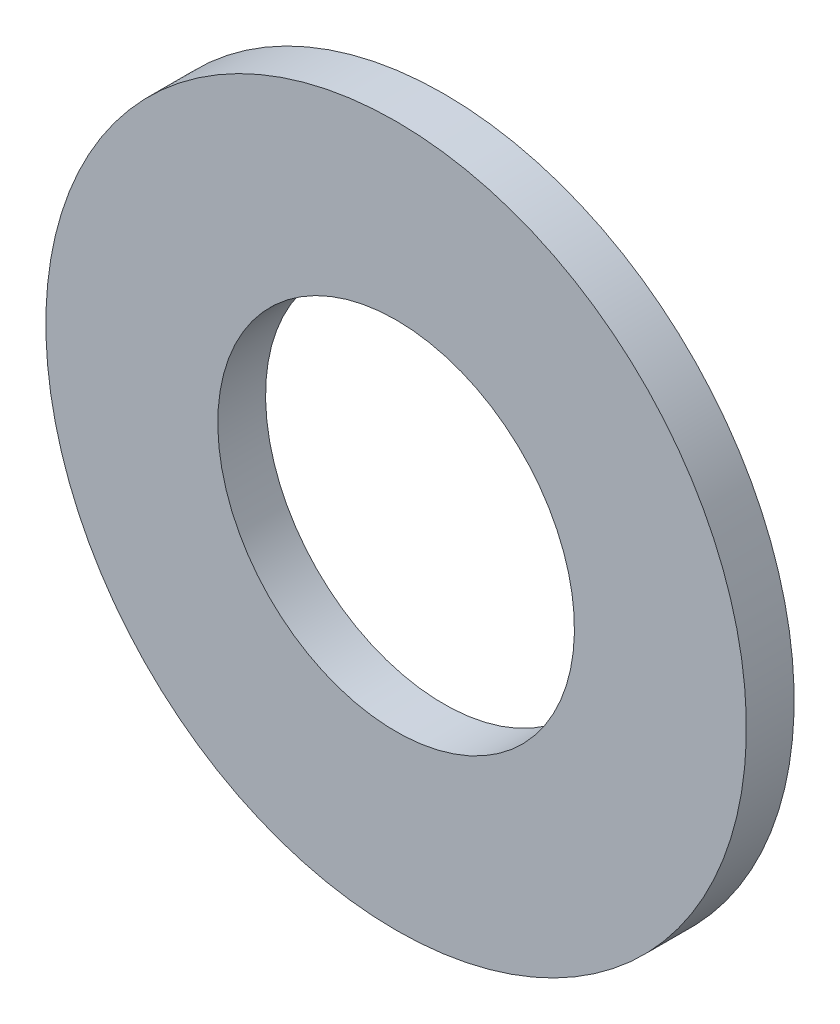
ISO-10303-21;
HEADER;
FILE_DESCRIPTION(('STEP AP214'),'2;1');
FILE_NAME('part.step','',(''),(''),'','','');
FILE_SCHEMA(('AUTOMOTIVE_DESIGN { 1 0 10303 214 1 1 1 1 }'));
ENDSEC;
DATA;
#1=APPLICATION_CONTEXT('core data for automotive mechanical design processes');
#2=APPLICATION_PROTOCOL_DEFINITION('international standard','automotive_design',2000,#1);
#3=PRODUCT_CONTEXT('',#1,'mechanical');
#4=PRODUCT('Part','Part','',(#3));
#5=PRODUCT_RELATED_PRODUCT_CATEGORY('part','',(#4));
#6=PRODUCT_DEFINITION_FORMATION('','',#4);
#7=PRODUCT_DEFINITION_CONTEXT('part definition',#1,'design');
#8=PRODUCT_DEFINITION('design','',#6,#7);
#9=PRODUCT_DEFINITION_SHAPE('','',#8);
#10=(LENGTH_UNIT() NAMED_UNIT(*) SI_UNIT(.MILLI.,.METRE.));
#11=(NAMED_UNIT(*) PLANE_ANGLE_UNIT() SI_UNIT($,.RADIAN.));
#12=(NAMED_UNIT(*) SI_UNIT($,.STERADIAN.) SOLID_ANGLE_UNIT());
#13=UNCERTAINTY_MEASURE_WITH_UNIT(LENGTH_MEASURE(1.E-05),#10,'distance_accuracy_value','');
#14=(GEOMETRIC_REPRESENTATION_CONTEXT(3) GLOBAL_UNCERTAINTY_ASSIGNED_CONTEXT((#13)) GLOBAL_UNIT_ASSIGNED_CONTEXT((#10,
#11,#12)) REPRESENTATION_CONTEXT('',''));
#15=CARTESIAN_POINT('',(0.,0.,0.));
#16=DIRECTION('',(0.,0.,1.));
#17=DIRECTION('',(1.,0.,0.));
#18=AXIS2_PLACEMENT_3D('',#15,#16,#17);
#19=CARTESIAN_POINT('',(0.,0.,0.));
#20=DIRECTION('',(0.,0.,-1.));
#21=DIRECTION('',(0.,1.,0.));
#22=AXIS2_PLACEMENT_3D('',#19,#20,#21);
#23=CYLINDRICAL_SURFACE('',#22,5.6);
#24=CARTESIAN_POINT('',(0.,0.,1.5));
#25=DIRECTION('',(0.,0.,-1.));
#26=DIRECTION('',(0.,1.,0.));
#27=AXIS2_PLACEMENT_3D('',#24,#25,#26);
#28=CIRCLE('',#27,5.6);
#29=CARTESIAN_POINT('',(0.,5.6,1.5));
#30=VERTEX_POINT('',#29);
#31=EDGE_CURVE('E10',#30,#30,#28,.T.);
#32=ORIENTED_EDGE('',*,*,#31,.F.);
#33=EDGE_LOOP('',(#32));
#34=FACE_BOUND('',#33,.T.);
#35=CARTESIAN_POINT('',(0.,0.,0.));
#36=DIRECTION('',(0.,0.,-1.));
#37=DIRECTION('',(0.,1.,0.));
#38=AXIS2_PLACEMENT_3D('',#35,#36,#37);
#39=CIRCLE('',#38,5.6);
#40=CARTESIAN_POINT('',(0.,5.6,0.));
#41=VERTEX_POINT('',#40);
#42=EDGE_CURVE('E29',#41,#41,#39,.T.);
#43=ORIENTED_EDGE('',*,*,#42,.T.);
#44=EDGE_LOOP('',(#43));
#45=FACE_BOUND('',#44,.T.);
#46=ADVANCED_FACE('F15',(#34,#45),#23,.F.);
#47=CARTESIAN_POINT('',(11.,0.,1.5));
#48=DIRECTION('',(0.,0.,1.));
#49=DIRECTION('',(0.,-1.,0.));
#50=AXIS2_PLACEMENT_3D('',#47,#48,#49);
#51=PLANE('',#50);
#52=ORIENTED_EDGE('',*,*,#31,.T.);
#53=EDGE_LOOP('',(#52));
#54=FACE_BOUND('',#53,.T.);
#55=CARTESIAN_POINT('',(0.,0.,1.5));
#56=DIRECTION('',(0.,0.,-1.));
#57=DIRECTION('',(0.,1.,0.));
#58=AXIS2_PLACEMENT_3D('',#55,#56,#57);
#59=CIRCLE('',#58,11.);
#60=CARTESIAN_POINT('',(0.,11.,1.5));
#61=VERTEX_POINT('',#60);
#62=EDGE_CURVE('E21',#61,#61,#59,.T.);
#63=ORIENTED_EDGE('',*,*,#62,.F.);
#64=EDGE_LOOP('',(#63));
#65=FACE_BOUND('',#64,.T.);
#66=ADVANCED_FACE('F45',(#54,#65),#51,.T.);
#67=CARTESIAN_POINT('',(0.,0.,0.));
#68=DIRECTION('',(0.,0.,-1.));
#69=DIRECTION('',(0.,1.,0.));
#70=AXIS2_PLACEMENT_3D('',#67,#68,#69);
#71=CYLINDRICAL_SURFACE('',#70,11.);
#72=ORIENTED_EDGE('',*,*,#62,.T.);
#73=EDGE_LOOP('',(#72));
#74=FACE_BOUND('',#73,.T.);
#75=CARTESIAN_POINT('',(0.,0.,0.));
#76=DIRECTION('',(0.,0.,-1.));
#77=DIRECTION('',(0.,1.,0.));
#78=AXIS2_PLACEMENT_3D('',#75,#76,#77);
#79=CIRCLE('',#78,11.);
#80=CARTESIAN_POINT('',(0.,11.,0.));
#81=VERTEX_POINT('',#80);
#82=EDGE_CURVE('E25',#81,#81,#79,.T.);
#83=ORIENTED_EDGE('',*,*,#82,.F.);
#84=EDGE_LOOP('',(#83));
#85=FACE_BOUND('',#84,.T.);
#86=ADVANCED_FACE('F38',(#74,#85),#71,.T.);
#87=CARTESIAN_POINT('',(5.6,0.,0.));
#88=DIRECTION('',(0.,0.,-1.));
#89=DIRECTION('',(0.,1.,0.));
#90=AXIS2_PLACEMENT_3D('',#87,#88,#89);
#91=PLANE('',#90);
#92=ORIENTED_EDGE('',*,*,#82,.T.);
#93=EDGE_LOOP('',(#92));
#94=FACE_BOUND('',#93,.T.);
#95=ORIENTED_EDGE('',*,*,#42,.F.);
#96=EDGE_LOOP('',(#95));
#97=FACE_BOUND('',#96,.T.);
#98=ADVANCED_FACE('F36',(#94,#97),#91,.T.);
#99=CLOSED_SHELL('',(#46,#66,#86,#98));
#100=MANIFOLD_SOLID_BREP('B1',#99);
#101=ADVANCED_BREP_SHAPE_REPRESENTATION('',(#18,#100),#14);
#102=SHAPE_DEFINITION_REPRESENTATION(#9,#101);
ENDSEC;
END-ISO-10303-21;
